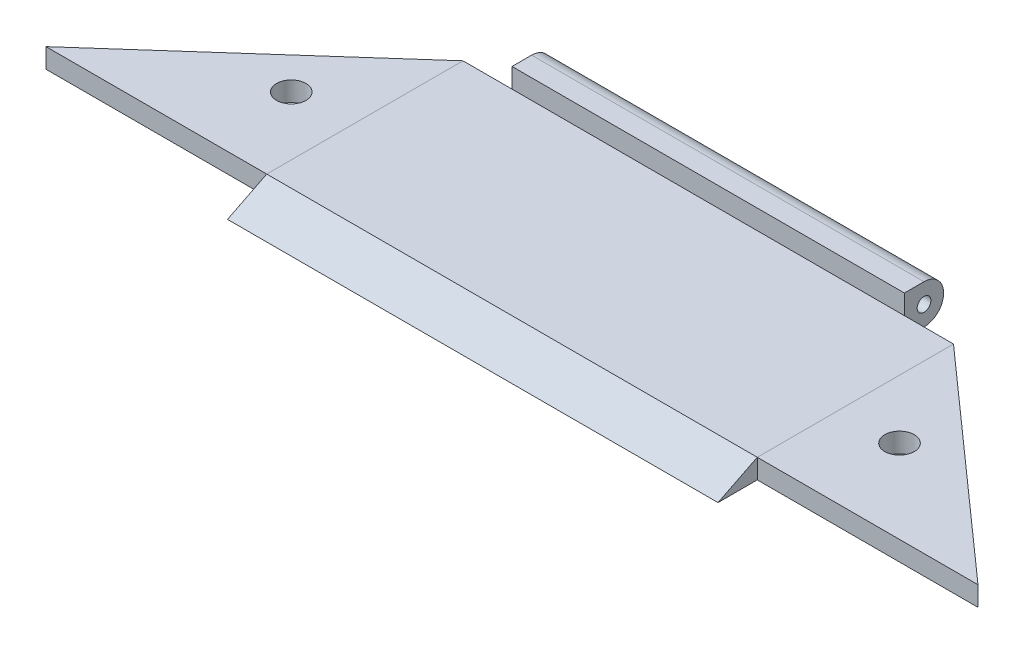
ISO-10303-21;
HEADER;
FILE_DESCRIPTION(('STEP AP214'),'2;1');
FILE_NAME('part.step','',(''),(''),'','','');
FILE_SCHEMA(('AUTOMOTIVE_DESIGN { 1 0 10303 214 1 1 1 1 }'));
ENDSEC;
DATA;
#1=APPLICATION_CONTEXT('core data for automotive mechanical design processes');
#2=APPLICATION_PROTOCOL_DEFINITION('international standard','automotive_design',2000,#1);
#3=PRODUCT_CONTEXT('',#1,'mechanical');
#4=PRODUCT('Part','Part','',(#3));
#5=PRODUCT_RELATED_PRODUCT_CATEGORY('part','',(#4));
#6=PRODUCT_DEFINITION_FORMATION('','',#4);
#7=PRODUCT_DEFINITION_CONTEXT('part definition',#1,'design');
#8=PRODUCT_DEFINITION('design','',#6,#7);
#9=PRODUCT_DEFINITION_SHAPE('','',#8);
#10=(LENGTH_UNIT() NAMED_UNIT(*) SI_UNIT(.MILLI.,.METRE.));
#11=(NAMED_UNIT(*) PLANE_ANGLE_UNIT() SI_UNIT($,.RADIAN.));
#12=(NAMED_UNIT(*) SI_UNIT($,.STERADIAN.) SOLID_ANGLE_UNIT());
#13=UNCERTAINTY_MEASURE_WITH_UNIT(LENGTH_MEASURE(1.E-05),#10,'distance_accuracy_value','');
#14=(GEOMETRIC_REPRESENTATION_CONTEXT(3) GLOBAL_UNCERTAINTY_ASSIGNED_CONTEXT((#13)) GLOBAL_UNIT_ASSIGNED_CONTEXT((#10,
#11,#12)) REPRESENTATION_CONTEXT('',''));
#15=CARTESIAN_POINT('',(0.,0.,0.));
#16=DIRECTION('',(0.,0.,1.));
#17=DIRECTION('',(1.,0.,0.));
#18=AXIS2_PLACEMENT_3D('',#15,#16,#17);
#19=CARTESIAN_POINT('',(-11.9069810338864,0.,-607.96292003175));
#20=DIRECTION('',(-0.66436383882992,0.,0.74740931868366));
#21=DIRECTION('',(0.74740931868366,0.,0.66436383882992));
#22=AXIS2_PLACEMENT_3D('',#19,#20,#21);
#23=PLANE('',#22);
#24=DIRECTION('',(0.74740931868366,0.,0.66436383882992));
#25=VECTOR('',#24,1.);
#26=CARTESIAN_POINT('',(-11.9069810338864,20.0000000000001,-607.96292003175));
#27=LINE('',#26,#25);
#28=CARTESIAN_POINT('',(500.,20.,-152.934492446074));
#29=VERTEX_POINT('',#28);
#30=CARTESIAN_POINT('',(725.,20.,47.0655075539265));
#31=VERTEX_POINT('',#30);
#32=EDGE_CURVE('E100',#29,#31,#27,.T.);
#33=ORIENTED_EDGE('',*,*,#32,.T.);
#34=DIRECTION('',(0.,1.,0.));
#35=VECTOR('',#34,1.);
#36=CARTESIAN_POINT('',(725.,0.,47.0655075539265));
#37=LINE('',#36,#35);
#38=CARTESIAN_POINT('',(725.,0.,47.0655075539265));
#39=VERTEX_POINT('',#38);
#40=EDGE_CURVE('E12',#39,#31,#37,.T.);
#41=ORIENTED_EDGE('',*,*,#40,.F.);
#42=DIRECTION('',(0.74740931868366,0.,0.66436383882992));
#43=VECTOR('',#42,1.);
#44=CARTESIAN_POINT('',(-11.9069810338864,0.,-607.96292003175));
#45=LINE('',#44,#43);
#46=CARTESIAN_POINT('',(500.,0.,-152.934492446074));
#47=VERTEX_POINT('',#46);
#48=EDGE_CURVE('E62',#47,#39,#45,.T.);
#49=ORIENTED_EDGE('',*,*,#48,.F.);
#50=DIRECTION('',(0.,1.,0.));
#51=VECTOR('',#50,1.);
#52=CARTESIAN_POINT('',(500.,0.,-152.934492446074));
#53=LINE('',#52,#51);
#54=EDGE_CURVE('E47',#47,#29,#53,.T.);
#55=ORIENTED_EDGE('',*,*,#54,.T.);
#56=EDGE_LOOP('',(#33,#41,#49,#55));
#57=FACE_BOUND('',#56,.T.);
#58=ADVANCED_FACE('F43',(#57),#23,.F.);
#59=CARTESIAN_POINT('',(-505.265583332266,0.,47.0655075539265));
#60=DIRECTION('',(0.,0.,1.));
#61=DIRECTION('',(0.,-1.,0.));
#62=AXIS2_PLACEMENT_3D('',#59,#60,#61);
#63=PLANE('',#62);
#64=DIRECTION('',(1.,0.,0.));
#65=VECTOR('',#64,1.);
#66=CARTESIAN_POINT('',(-505.265583332266,20.,47.0655075539265));
#67=LINE('',#66,#65);
#68=CARTESIAN_POINT('',(500.,20.,47.0655075539265));
#69=VERTEX_POINT('',#68);
#70=EDGE_CURVE('E93',#69,#31,#67,.T.);
#71=ORIENTED_EDGE('',*,*,#70,.F.);
#72=DIRECTION('',(0.,1.,0.));
#73=VECTOR('',#72,1.);
#74=CARTESIAN_POINT('',(500.,0.,47.0655075539265));
#75=LINE('',#74,#73);
#76=CARTESIAN_POINT('',(500.,0.,47.0655075539265));
#77=VERTEX_POINT('',#76);
#78=EDGE_CURVE('E53',#77,#69,#75,.T.);
#79=ORIENTED_EDGE('',*,*,#78,.F.);
#80=DIRECTION('',(1.,0.,0.));
#81=VECTOR('',#80,1.);
#82=CARTESIAN_POINT('',(-505.265583332266,0.,47.0655075539265));
#83=LINE('',#82,#81);
#84=EDGE_CURVE('E83',#77,#39,#83,.T.);
#85=ORIENTED_EDGE('',*,*,#84,.T.);
#86=ORIENTED_EDGE('',*,*,#40,.T.);
#87=EDGE_LOOP('',(#71,#79,#85,#86));
#88=FACE_BOUND('',#87,.T.);
#89=ADVANCED_FACE('F106',(#88),#63,.T.);
#90=CARTESIAN_POINT('',(560.,0.,-37.9344924460735));
#91=DIRECTION('',(0.,1.,0.));
#92=DIRECTION('',(0.,0.,1.));
#93=AXIS2_PLACEMENT_3D('',#90,#91,#92);
#94=CYLINDRICAL_SURFACE('',#93,15.);
#95=CARTESIAN_POINT('',(560.,0.,-37.9344924460735));
#96=DIRECTION('',(0.,1.,0.));
#97=DIRECTION('',(0.,0.,1.));
#98=AXIS2_PLACEMENT_3D('',#95,#96,#97);
#99=CIRCLE('',#98,15.);
#100=CARTESIAN_POINT('',(560.,0.,-22.9344924460735));
#101=VERTEX_POINT('',#100);
#102=EDGE_CURVE('E90',#101,#101,#99,.T.);
#103=ORIENTED_EDGE('',*,*,#102,.F.);
#104=EDGE_LOOP('',(#103));
#105=FACE_BOUND('',#104,.T.);
#106=CARTESIAN_POINT('',(560.,20.,-37.9344924460735));
#107=DIRECTION('',(0.,1.,0.));
#108=DIRECTION('',(0.,0.,1.));
#109=AXIS2_PLACEMENT_3D('',#106,#107,#108);
#110=CIRCLE('',#109,15.);
#111=CARTESIAN_POINT('',(560.,20.,-22.9344924460735));
#112=VERTEX_POINT('',#111);
#113=EDGE_CURVE('E97',#112,#112,#110,.T.);
#114=ORIENTED_EDGE('',*,*,#113,.T.);
#115=EDGE_LOOP('',(#114));
#116=FACE_BOUND('',#115,.T.);
#117=ADVANCED_FACE('F45',(#105,#116),#94,.F.);
#118=CARTESIAN_POINT('',(500.,0.,-52.9344924460734));
#119=DIRECTION('',(1.,0.,0.));
#120=DIRECTION('',(0.,0.,-1.));
#121=AXIS2_PLACEMENT_3D('',#118,#119,#120);
#122=PLANE('',#121);
#123=DIRECTION('',(0.,0.,-1.));
#124=VECTOR('',#123,1.);
#125=CARTESIAN_POINT('',(500.,20.,-52.9344924460734));
#126=LINE('',#125,#124);
#127=EDGE_CURVE('E87',#69,#29,#126,.T.);
#128=ORIENTED_EDGE('',*,*,#127,.T.);
#129=ORIENTED_EDGE('',*,*,#54,.F.);
#130=DIRECTION('',(0.,0.,-1.));
#131=VECTOR('',#130,1.);
#132=CARTESIAN_POINT('',(500.,0.,-52.9344924460734));
#133=LINE('',#132,#131);
#134=EDGE_CURVE('E80',#77,#47,#133,.T.);
#135=ORIENTED_EDGE('',*,*,#134,.F.);
#136=ORIENTED_EDGE('',*,*,#78,.T.);
#137=EDGE_LOOP('',(#128,#129,#135,#136));
#138=FACE_BOUND('',#137,.T.);
#139=ADVANCED_FACE('F86',(#138),#122,.F.);
#140=CARTESIAN_POINT('',(-505.265583332266,0.,-52.9344924460734));
#141=DIRECTION('',(0.,1.,0.));
#142=DIRECTION('',(0.,0.,1.));
#143=AXIS2_PLACEMENT_3D('',#140,#141,#142);
#144=PLANE('',#143);
#145=ORIENTED_EDGE('',*,*,#102,.T.);
#146=EDGE_LOOP('',(#145));
#147=FACE_BOUND('',#146,.T.);
#148=ORIENTED_EDGE('',*,*,#48,.T.);
#149=ORIENTED_EDGE('',*,*,#84,.F.);
#150=ORIENTED_EDGE('',*,*,#134,.T.);
#151=EDGE_LOOP('',(#148,#149,#150));
#152=FACE_BOUND('',#151,.T.);
#153=ADVANCED_FACE('F82',(#147,#152),#144,.F.);
#154=CARTESIAN_POINT('',(-505.265583332266,20.,-52.9344924460734));
#155=DIRECTION('',(0.,1.,0.));
#156=DIRECTION('',(0.,0.,1.));
#157=AXIS2_PLACEMENT_3D('',#154,#155,#156);
#158=PLANE('',#157);
#159=ORIENTED_EDGE('',*,*,#113,.F.);
#160=EDGE_LOOP('',(#159));
#161=FACE_BOUND('',#160,.T.);
#162=ORIENTED_EDGE('',*,*,#32,.F.);
#163=ORIENTED_EDGE('',*,*,#127,.F.);
#164=ORIENTED_EDGE('',*,*,#70,.T.);
#165=EDGE_LOOP('',(#162,#163,#164));
#166=FACE_BOUND('',#165,.T.);
#167=ADVANCED_FACE('F105',(#161,#166),#158,.T.);
#168=CLOSED_SHELL('',(#58,#89,#117,#139,#153,#167));
#169=MANIFOLD_SOLID_BREP('B2',#168);
#170=CARTESIAN_POINT('',(-505.265583332266,0.,47.0655075539265));
#171=DIRECTION('',(0.,0.,-1.));
#172=DIRECTION('',(0.,1.,0.));
#173=AXIS2_PLACEMENT_3D('',#170,#171,#172);
#174=PLANE('',#173);
#175=DIRECTION('',(-1.,0.,0.));
#176=VECTOR('',#175,1.);
#177=CARTESIAN_POINT('',(-505.265583332266,20.,47.0655075539265));
#178=LINE('',#177,#176);
#179=CARTESIAN_POINT('',(0.,20.,47.0655075539265));
#180=VERTEX_POINT('',#179);
#181=CARTESIAN_POINT('',(-225.,20.,47.0655075539265));
#182=VERTEX_POINT('',#181);
#183=EDGE_CURVE('E227',#180,#182,#178,.T.);
#184=ORIENTED_EDGE('',*,*,#183,.T.);
#185=DIRECTION('',(0.,1.,0.));
#186=VECTOR('',#185,1.);
#187=CARTESIAN_POINT('',(-225.,0.,47.0655075539265));
#188=LINE('',#187,#186);
#189=CARTESIAN_POINT('',(-225.,0.,47.0655075539265));
#190=VERTEX_POINT('',#189);
#191=EDGE_CURVE('E41',#190,#182,#188,.T.);
#192=ORIENTED_EDGE('',*,*,#191,.F.);
#193=DIRECTION('',(-1.,0.,0.));
#194=VECTOR('',#193,1.);
#195=CARTESIAN_POINT('',(-505.265583332266,0.,47.0655075539265));
#196=LINE('',#195,#194);
#197=CARTESIAN_POINT('',(0.,0.,47.0655075539265));
#198=VERTEX_POINT('',#197);
#199=EDGE_CURVE('E188',#198,#190,#196,.T.);
#200=ORIENTED_EDGE('',*,*,#199,.F.);
#201=DIRECTION('',(0.,1.,0.));
#202=VECTOR('',#201,1.);
#203=CARTESIAN_POINT('',(0.,0.,47.0655075539265));
#204=LINE('',#203,#202);
#205=EDGE_CURVE('E173',#198,#180,#204,.T.);
#206=ORIENTED_EDGE('',*,*,#205,.T.);
#207=EDGE_LOOP('',(#184,#192,#200,#206));
#208=FACE_BOUND('',#207,.T.);
#209=ADVANCED_FACE('F170',(#208),#174,.F.);
#210=CARTESIAN_POINT('',(-331.906981033887,0.,142.093935139604));
#211=DIRECTION('',(-0.66436383882992,0.,-0.74740931868366));
#212=DIRECTION('',(-0.74740931868366,0.,0.66436383882992));
#213=AXIS2_PLACEMENT_3D('',#210,#211,#212);
#214=PLANE('',#213);
#215=DIRECTION('',(-0.74740931868366,0.,0.66436383882992));
#216=VECTOR('',#215,1.);
#217=CARTESIAN_POINT('',(-331.906981033887,20.,142.093935139604));
#218=LINE('',#217,#216);
#219=CARTESIAN_POINT('',(0.,20.,-152.934492446074));
#220=VERTEX_POINT('',#219);
#221=EDGE_CURVE('E221',#220,#182,#218,.T.);
#222=ORIENTED_EDGE('',*,*,#221,.F.);
#223=DIRECTION('',(0.,1.,0.));
#224=VECTOR('',#223,1.);
#225=CARTESIAN_POINT('',(0.,0.,-152.934492446074));
#226=LINE('',#225,#224);
#227=CARTESIAN_POINT('',(0.,0.,-152.934492446074));
#228=VERTEX_POINT('',#227);
#229=EDGE_CURVE('E179',#228,#220,#226,.T.);
#230=ORIENTED_EDGE('',*,*,#229,.F.);
#231=DIRECTION('',(-0.74740931868366,0.,0.66436383882992));
#232=VECTOR('',#231,1.);
#233=CARTESIAN_POINT('',(-331.906981033887,0.,142.093935139604));
#234=LINE('',#233,#232);
#235=EDGE_CURVE('E210',#228,#190,#234,.T.);
#236=ORIENTED_EDGE('',*,*,#235,.T.);
#237=ORIENTED_EDGE('',*,*,#191,.T.);
#238=EDGE_LOOP('',(#222,#230,#236,#237));
#239=FACE_BOUND('',#238,.T.);
#240=ADVANCED_FACE('F234',(#239),#214,.T.);
#241=CARTESIAN_POINT('',(0.,0.,-52.9344924460734));
#242=DIRECTION('',(-1.,0.,0.));
#243=DIRECTION('',(0.,0.,1.));
#244=AXIS2_PLACEMENT_3D('',#241,#242,#243);
#245=PLANE('',#244);
#246=DIRECTION('',(0.,0.,1.));
#247=VECTOR('',#246,1.);
#248=CARTESIAN_POINT('',(0.,20.,-52.9344924460734));
#249=LINE('',#248,#247);
#250=EDGE_CURVE('E214',#220,#180,#249,.T.);
#251=ORIENTED_EDGE('',*,*,#250,.T.);
#252=ORIENTED_EDGE('',*,*,#205,.F.);
#253=DIRECTION('',(0.,0.,1.));
#254=VECTOR('',#253,1.);
#255=CARTESIAN_POINT('',(0.,0.,-52.9344924460734));
#256=LINE('',#255,#254);
#257=EDGE_CURVE('E206',#228,#198,#256,.T.);
#258=ORIENTED_EDGE('',*,*,#257,.F.);
#259=ORIENTED_EDGE('',*,*,#229,.T.);
#260=EDGE_LOOP('',(#251,#252,#258,#259));
#261=FACE_BOUND('',#260,.T.);
#262=ADVANCED_FACE('F213',(#261),#245,.F.);
#263=CARTESIAN_POINT('',(-60.0000000000001,0.,-37.9344924460735));
#264=DIRECTION('',(0.,1.,0.));
#265=DIRECTION('',(0.,0.,1.));
#266=AXIS2_PLACEMENT_3D('',#263,#264,#265);
#267=CYLINDRICAL_SURFACE('',#266,15.);
#268=CARTESIAN_POINT('',(-60.0000000000001,0.,-37.9344924460735));
#269=DIRECTION('',(0.,1.,0.));
#270=DIRECTION('',(0.,0.,1.));
#271=AXIS2_PLACEMENT_3D('',#268,#269,#270);
#272=CIRCLE('',#271,15.);
#273=CARTESIAN_POINT('',(-60.0000000000001,0.,-22.9344924460735));
#274=VERTEX_POINT('',#273);
#275=EDGE_CURVE('E217',#274,#274,#272,.F.);
#276=ORIENTED_EDGE('',*,*,#275,.T.);
#277=EDGE_LOOP('',(#276));
#278=FACE_BOUND('',#277,.T.);
#279=CARTESIAN_POINT('',(-60.0000000000001,20.,-37.9344924460735));
#280=DIRECTION('',(0.,1.,0.));
#281=DIRECTION('',(0.,0.,1.));
#282=AXIS2_PLACEMENT_3D('',#279,#280,#281);
#283=CIRCLE('',#282,15.);
#284=CARTESIAN_POINT('',(-60.0000000000001,20.,-22.9344924460735));
#285=VERTEX_POINT('',#284);
#286=EDGE_CURVE('E218',#285,#285,#283,.F.);
#287=ORIENTED_EDGE('',*,*,#286,.F.);
#288=EDGE_LOOP('',(#287));
#289=FACE_BOUND('',#288,.T.);
#290=ADVANCED_FACE('F241',(#278,#289),#267,.F.);
#291=CARTESIAN_POINT('',(-505.265583332266,0.,-52.9344924460734));
#292=DIRECTION('',(0.,1.,0.));
#293=DIRECTION('',(0.,0.,1.));
#294=AXIS2_PLACEMENT_3D('',#291,#292,#293);
#295=PLANE('',#294);
#296=ORIENTED_EDGE('',*,*,#199,.T.);
#297=ORIENTED_EDGE('',*,*,#235,.F.);
#298=ORIENTED_EDGE('',*,*,#257,.T.);
#299=EDGE_LOOP('',(#296,#297,#298));
#300=FACE_BOUND('',#299,.T.);
#301=ORIENTED_EDGE('',*,*,#275,.F.);
#302=EDGE_LOOP('',(#301));
#303=FACE_BOUND('',#302,.T.);
#304=ADVANCED_FACE('F208',(#300,#303),#295,.F.);
#305=CARTESIAN_POINT('',(-505.265583332266,20.,-52.9344924460734));
#306=DIRECTION('',(0.,1.,0.));
#307=DIRECTION('',(0.,0.,1.));
#308=AXIS2_PLACEMENT_3D('',#305,#306,#307);
#309=PLANE('',#308);
#310=ORIENTED_EDGE('',*,*,#183,.F.);
#311=ORIENTED_EDGE('',*,*,#250,.F.);
#312=ORIENTED_EDGE('',*,*,#221,.T.);
#313=EDGE_LOOP('',(#310,#311,#312));
#314=FACE_BOUND('',#313,.T.);
#315=ORIENTED_EDGE('',*,*,#286,.T.);
#316=EDGE_LOOP('',(#315));
#317=FACE_BOUND('',#316,.T.);
#318=ADVANCED_FACE('F232',(#314,#317),#309,.T.);
#319=CLOSED_SHELL('',(#209,#240,#262,#290,#304,#318));
#320=MANIFOLD_SOLID_BREP('B6',#319);
#321=CARTESIAN_POINT('',(500.,0.,-297.310962724989));
#322=DIRECTION('',(0.,1.,0.));
#323=DIRECTION('',(0.,0.,1.));
#324=AXIS2_PLACEMENT_3D('',#321,#322,#323);
#325=PLANE('',#324);
#326=DIRECTION('',(0.,0.,-1.));
#327=VECTOR('',#326,1.);
#328=CARTESIAN_POINT('',(50.,0.,-297.310962724989));
#329=LINE('',#328,#327);
#330=CARTESIAN_POINT('',(50.,0.,-152.934492446074));
#331=VERTEX_POINT('',#330);
#332=CARTESIAN_POINT('',(50.,0.,-172.934492446074));
#333=VERTEX_POINT('',#332);
#334=EDGE_CURVE('E396',#331,#333,#329,.T.);
#335=ORIENTED_EDGE('',*,*,#334,.T.);
#336=DIRECTION('',(-1.,0.,0.));
#337=VECTOR('',#336,1.);
#338=CARTESIAN_POINT('',(500.,0.,-172.934492446074));
#339=LINE('',#338,#337);
#340=CARTESIAN_POINT('',(450.,0.,-172.934492446074));
#341=VERTEX_POINT('',#340);
#342=EDGE_CURVE('E408',#333,#341,#339,.F.);
#343=ORIENTED_EDGE('',*,*,#342,.T.);
#344=DIRECTION('',(0.,0.,1.));
#345=VECTOR('',#344,1.);
#346=CARTESIAN_POINT('',(450.,0.,-297.310962724989));
#347=LINE('',#346,#345);
#348=CARTESIAN_POINT('',(450.,0.,-152.934492446074));
#349=VERTEX_POINT('',#348);
#350=EDGE_CURVE('E403',#341,#349,#347,.T.);
#351=ORIENTED_EDGE('',*,*,#350,.T.);
#352=DIRECTION('',(1.,0.,0.));
#353=VECTOR('',#352,1.);
#354=CARTESIAN_POINT('',(500.,0.,-152.934492446074));
#355=LINE('',#354,#353);
#356=CARTESIAN_POINT('',(500.,0.,-152.934492446074));
#357=VERTEX_POINT('',#356);
#358=EDGE_CURVE('E404',#349,#357,#355,.T.);
#359=ORIENTED_EDGE('',*,*,#358,.T.);
#360=DIRECTION('',(0.,0.,-1.));
#361=VECTOR('',#360,1.);
#362=CARTESIAN_POINT('',(500.,0.,-297.310962724989));
#363=LINE('',#362,#361);
#364=CARTESIAN_POINT('',(500.,0.,87.0655075539265));
#365=VERTEX_POINT('',#364);
#366=EDGE_CURVE('E433',#365,#357,#363,.T.);
#367=ORIENTED_EDGE('',*,*,#366,.F.);
#368=DIRECTION('',(-1.,0.,0.));
#369=VECTOR('',#368,1.);
#370=CARTESIAN_POINT('',(500.,0.,87.0655075539265));
#371=LINE('',#370,#369);
#372=CARTESIAN_POINT('',(0.,0.,87.0655075539265));
#373=VERTEX_POINT('',#372);
#374=EDGE_CURVE('E441',#365,#373,#371,.T.);
#375=ORIENTED_EDGE('',*,*,#374,.T.);
#376=DIRECTION('',(0.,0.,-1.));
#377=VECTOR('',#376,1.);
#378=CARTESIAN_POINT('',(0.,0.,-297.310962724989));
#379=LINE('',#378,#377);
#380=CARTESIAN_POINT('',(0.,0.,-152.934492446074));
#381=VERTEX_POINT('',#380);
#382=EDGE_CURVE('E432',#373,#381,#379,.T.);
#383=ORIENTED_EDGE('',*,*,#382,.T.);
#384=DIRECTION('',(1.,0.,0.));
#385=VECTOR('',#384,1.);
#386=CARTESIAN_POINT('',(500.,0.,-152.934492446074));
#387=LINE('',#386,#385);
#388=EDGE_CURVE('E397',#381,#331,#387,.T.);
#389=ORIENTED_EDGE('',*,*,#388,.T.);
#390=EDGE_LOOP('',(#335,#343,#351,#359,#367,#375,#383,#389));
#391=FACE_BOUND('',#390,.T.);
#392=ADVANCED_FACE('F289',(#391),#325,.F.);
#393=CARTESIAN_POINT('',(500.,40.,-297.310962724989));
#394=DIRECTION('',(0.,1.,0.));
#395=DIRECTION('',(0.,0.,1.));
#396=AXIS2_PLACEMENT_3D('',#393,#394,#395);
#397=PLANE('',#396);
#398=DIRECTION('',(0.,0.,1.));
#399=VECTOR('',#398,1.);
#400=CARTESIAN_POINT('',(450.,40.,-192.934492446074));
#401=LINE('',#400,#399);
#402=CARTESIAN_POINT('',(450.,40.,-172.934492446074));
#403=VERTEX_POINT('',#402);
#404=CARTESIAN_POINT('',(450.,40.,-152.934492446074));
#405=VERTEX_POINT('',#404);
#406=EDGE_CURVE('E360',#403,#405,#401,.T.);
#407=ORIENTED_EDGE('',*,*,#406,.F.);
#408=DIRECTION('',(-1.,0.,0.));
#409=VECTOR('',#408,1.);
#410=CARTESIAN_POINT('',(50.,40.,-172.934492446074));
#411=LINE('',#410,#409);
#412=CARTESIAN_POINT('',(50.,40.,-172.934492446074));
#413=VERTEX_POINT('',#412);
#414=EDGE_CURVE('E168',#403,#413,#411,.T.);
#415=ORIENTED_EDGE('',*,*,#414,.T.);
#416=DIRECTION('',(0.,0.,-1.));
#417=VECTOR('',#416,1.);
#418=CARTESIAN_POINT('',(50.,40.,-192.934492446074));
#419=LINE('',#418,#417);
#420=CARTESIAN_POINT('',(50.,40.,-152.934492446074));
#421=VERTEX_POINT('',#420);
#422=EDGE_CURVE('E383',#421,#413,#419,.T.);
#423=ORIENTED_EDGE('',*,*,#422,.F.);
#424=DIRECTION('',(-1.,0.,0.));
#425=VECTOR('',#424,1.);
#426=CARTESIAN_POINT('',(500.,40.,-152.934492446074));
#427=LINE('',#426,#425);
#428=EDGE_CURVE('E374',#405,#421,#427,.T.);
#429=ORIENTED_EDGE('',*,*,#428,.F.);
#430=EDGE_LOOP('',(#407,#415,#423,#429));
#431=FACE_BOUND('',#430,.T.);
#432=ADVANCED_FACE('F381',(#431),#397,.T.);
#433=CARTESIAN_POINT('',(500.,9.69893464448226,-152.934492446074));
#434=DIRECTION('',(0.,0.,1.));
#435=DIRECTION('',(1.,0.,0.));
#436=AXIS2_PLACEMENT_3D('',#433,#434,#435);
#437=PLANE('',#436);
#438=DIRECTION('',(0.,1.,0.));
#439=VECTOR('',#438,1.);
#440=CARTESIAN_POINT('',(450.,-460.,-152.934492446074));
#441=LINE('',#440,#439);
#442=CARTESIAN_POINT('',(450.,20.,-152.934492446074));
#443=VERTEX_POINT('',#442);
#444=EDGE_CURVE('E364',#443,#405,#441,.T.);
#445=ORIENTED_EDGE('',*,*,#444,.T.);
#446=ORIENTED_EDGE('',*,*,#428,.T.);
#447=DIRECTION('',(0.,1.,0.));
#448=VECTOR('',#447,1.);
#449=CARTESIAN_POINT('',(50.,-460.,-152.934492446074));
#450=LINE('',#449,#448);
#451=CARTESIAN_POINT('',(50.,20.,-152.934492446074));
#452=VERTEX_POINT('',#451);
#453=EDGE_CURVE('E421',#452,#421,#450,.T.);
#454=ORIENTED_EDGE('',*,*,#453,.F.);
#455=DIRECTION('',(-1.,0.,0.));
#456=VECTOR('',#455,1.);
#457=CARTESIAN_POINT('',(500.,20.,-152.934492446074));
#458=LINE('',#457,#456);
#459=EDGE_CURVE('E376',#443,#452,#458,.T.);
#460=ORIENTED_EDGE('',*,*,#459,.F.);
#461=EDGE_LOOP('',(#445,#446,#454,#460));
#462=FACE_BOUND('',#461,.T.);
#463=ADVANCED_FACE('F372',(#462),#437,.T.);
#464=CARTESIAN_POINT('',(500.,20.,-297.310962724989));
#465=DIRECTION('',(0.,-1.,0.));
#466=DIRECTION('',(0.,0.,-1.));
#467=AXIS2_PLACEMENT_3D('',#464,#465,#466);
#468=PLANE('',#467);
#469=DIRECTION('',(0.,0.,1.));
#470=VECTOR('',#469,1.);
#471=CARTESIAN_POINT('',(0.,20.,-297.310962724989));
#472=LINE('',#471,#470);
#473=CARTESIAN_POINT('',(0.,20.,-152.934492446074));
#474=VERTEX_POINT('',#473);
#475=CARTESIAN_POINT('',(0.,20.,47.0655075539265));
#476=VERTEX_POINT('',#475);
#477=EDGE_CURVE('E444',#474,#476,#472,.T.);
#478=ORIENTED_EDGE('',*,*,#477,.T.);
#479=DIRECTION('',(-1.,0.,0.));
#480=VECTOR('',#479,1.);
#481=CARTESIAN_POINT('',(500.,20.,47.0655075539265));
#482=LINE('',#481,#480);
#483=CARTESIAN_POINT('',(500.,20.,47.0655075539265));
#484=VERTEX_POINT('',#483);
#485=EDGE_CURVE('E448',#484,#476,#482,.T.);
#486=ORIENTED_EDGE('',*,*,#485,.F.);
#487=DIRECTION('',(0.,0.,1.));
#488=VECTOR('',#487,1.);
#489=CARTESIAN_POINT('',(500.,20.,-297.310962724989));
#490=LINE('',#489,#488);
#491=CARTESIAN_POINT('',(500.,20.,-152.934492446074));
#492=VERTEX_POINT('',#491);
#493=EDGE_CURVE('E436',#492,#484,#490,.T.);
#494=ORIENTED_EDGE('',*,*,#493,.F.);
#495=EDGE_CURVE('E385',#492,#443,#458,.T.);
#496=ORIENTED_EDGE('',*,*,#495,.T.);
#497=ORIENTED_EDGE('',*,*,#459,.T.);
#498=DIRECTION('',(-1.,0.,0.));
#499=VECTOR('',#498,1.);
#500=CARTESIAN_POINT('',(500.,20.,-152.934492446074));
#501=LINE('',#500,#499);
#502=EDGE_CURVE('E427',#452,#474,#501,.T.);
#503=ORIENTED_EDGE('',*,*,#502,.T.);
#504=EDGE_LOOP('',(#478,#486,#494,#496,#497,#503));
#505=FACE_BOUND('',#504,.T.);
#506=ADVANCED_FACE('F456',(#505),#468,.F.);
#507=CARTESIAN_POINT('',(500.,20.,-172.934492446074));
#508=DIRECTION('',(-1.,0.,0.));
#509=DIRECTION('',(0.,0.,1.));
#510=AXIS2_PLACEMENT_3D('',#507,#508,#509);
#511=CYLINDRICAL_SURFACE('',#510,7.00000000000001);
#512=CARTESIAN_POINT('',(450.,20.,-172.934492446074));
#513=DIRECTION('',(-1.,0.,0.));
#514=DIRECTION('',(0.,0.,1.));
#515=AXIS2_PLACEMENT_3D('',#512,#513,#514);
#516=CIRCLE('',#515,7.00000000000001);
#517=CARTESIAN_POINT('',(450.,20.,-165.934492446074));
#518=VERTEX_POINT('',#517);
#519=EDGE_CURVE('E400',#518,#518,#516,.T.);
#520=ORIENTED_EDGE('',*,*,#519,.F.);
#521=EDGE_LOOP('',(#520));
#522=FACE_BOUND('',#521,.T.);
#523=CARTESIAN_POINT('',(50.,20.,-172.934492446074));
#524=DIRECTION('',(1.,0.,0.));
#525=DIRECTION('',(0.,0.,-1.));
#526=AXIS2_PLACEMENT_3D('',#523,#524,#525);
#527=CIRCLE('',#526,7.00000000000001);
#528=CARTESIAN_POINT('',(50.,20.,-179.934492446074));
#529=VERTEX_POINT('',#528);
#530=EDGE_CURVE('E393',#529,#529,#527,.T.);
#531=ORIENTED_EDGE('',*,*,#530,.F.);
#532=EDGE_LOOP('',(#531));
#533=FACE_BOUND('',#532,.T.);
#534=ADVANCED_FACE('F487',(#522,#533),#511,.F.);
#535=CARTESIAN_POINT('',(500.,155.690375040462,-224.315242526999));
#536=DIRECTION('',(0.,-0.894427190999916,-0.447213595499958));
#537=DIRECTION('',(0.,0.447213595499958,-0.894427190999916));
#538=AXIS2_PLACEMENT_3D('',#535,#536,#537);
#539=PLANE('',#538);
#540=DIRECTION('',(0.,-0.447213595499958,0.894427190999916));
#541=VECTOR('',#540,1.);
#542=CARTESIAN_POINT('',(0.,155.690375040462,-224.315242526999));
#543=LINE('',#542,#541);
#544=EDGE_CURVE('E437',#476,#373,#543,.T.);
#545=ORIENTED_EDGE('',*,*,#544,.T.);
#546=ORIENTED_EDGE('',*,*,#374,.F.);
#547=DIRECTION('',(0.,-0.447213595499958,0.894427190999916));
#548=VECTOR('',#547,1.);
#549=CARTESIAN_POINT('',(500.,155.690375040462,-224.315242526999));
#550=LINE('',#549,#548);
#551=EDGE_CURVE('E439',#484,#365,#550,.T.);
#552=ORIENTED_EDGE('',*,*,#551,.F.);
#553=ORIENTED_EDGE('',*,*,#485,.T.);
#554=EDGE_LOOP('',(#545,#546,#552,#553));
#555=FACE_BOUND('',#554,.T.);
#556=ADVANCED_FACE('F489',(#555),#539,.F.);
#557=CARTESIAN_POINT('',(500.,9.69893464448226,-297.310962724989));
#558=DIRECTION('',(1.,0.,0.));
#559=DIRECTION('',(0.,0.,-1.));
#560=AXIS2_PLACEMENT_3D('',#557,#558,#559);
#561=PLANE('',#560);
#562=DIRECTION('',(0.,-1.,0.));
#563=VECTOR('',#562,1.);
#564=CARTESIAN_POINT('',(500.,9.69893464448226,-152.934492446074));
#565=LINE('',#564,#563);
#566=EDGE_CURVE('E388',#492,#357,#565,.T.);
#567=ORIENTED_EDGE('',*,*,#566,.F.);
#568=ORIENTED_EDGE('',*,*,#493,.T.);
#569=ORIENTED_EDGE('',*,*,#551,.T.);
#570=ORIENTED_EDGE('',*,*,#366,.T.);
#571=EDGE_LOOP('',(#567,#568,#569,#570));
#572=FACE_BOUND('',#571,.T.);
#573=ADVANCED_FACE('F495',(#572),#561,.T.);
#574=CARTESIAN_POINT('',(0.,9.69893464448226,-297.310962724989));
#575=DIRECTION('',(1.,0.,0.));
#576=DIRECTION('',(0.,0.,-1.));
#577=AXIS2_PLACEMENT_3D('',#574,#575,#576);
#578=PLANE('',#577);
#579=ORIENTED_EDGE('',*,*,#477,.F.);
#580=DIRECTION('',(0.,-1.,0.));
#581=VECTOR('',#580,1.);
#582=CARTESIAN_POINT('',(0.,9.69893464448226,-152.934492446074));
#583=LINE('',#582,#581);
#584=EDGE_CURVE('E384',#474,#381,#583,.T.);
#585=ORIENTED_EDGE('',*,*,#584,.T.);
#586=ORIENTED_EDGE('',*,*,#382,.F.);
#587=ORIENTED_EDGE('',*,*,#544,.F.);
#588=EDGE_LOOP('',(#579,#585,#586,#587));
#589=FACE_BOUND('',#588,.T.);
#590=ADVANCED_FACE('F503',(#589),#578,.F.);
#591=CARTESIAN_POINT('',(50.,-460.,-192.934492446074));
#592=DIRECTION('',(1.,0.,0.));
#593=DIRECTION('',(0.,0.,-1.));
#594=AXIS2_PLACEMENT_3D('',#591,#592,#593);
#595=PLANE('',#594);
#596=ORIENTED_EDGE('',*,*,#530,.T.);
#597=EDGE_LOOP('',(#596));
#598=FACE_BOUND('',#597,.T.);
#599=CARTESIAN_POINT('',(50.,20.,-172.934492446074));
#600=DIRECTION('',(1.,0.,0.));
#601=DIRECTION('',(0.,0.,-1.));
#602=AXIS2_PLACEMENT_3D('',#599,#600,#601);
#603=CIRCLE('',#602,20.);
#604=CARTESIAN_POINT('',(50.,20.,-192.934492446074));
#605=VERTEX_POINT('',#604);
#606=EDGE_CURVE('E399',#413,#605,#603,.F.);
#607=ORIENTED_EDGE('',*,*,#606,.T.);
#608=CARTESIAN_POINT('',(50.,20.,-172.934492446074));
#609=DIRECTION('',(1.,0.,0.));
#610=DIRECTION('',(0.,0.,-1.));
#611=AXIS2_PLACEMENT_3D('',#608,#609,#610);
#612=CIRCLE('',#611,20.);
#613=EDGE_CURVE('E406',#605,#333,#612,.F.);
#614=ORIENTED_EDGE('',*,*,#613,.T.);
#615=ORIENTED_EDGE('',*,*,#334,.F.);
#616=EDGE_CURVE('E426',#331,#452,#450,.T.);
#617=ORIENTED_EDGE('',*,*,#616,.T.);
#618=ORIENTED_EDGE('',*,*,#453,.T.);
#619=ORIENTED_EDGE('',*,*,#422,.T.);
#620=EDGE_LOOP('',(#607,#614,#615,#617,#618,#619));
#621=FACE_BOUND('',#620,.T.);
#622=ADVANCED_FACE('F464',(#598,#621),#595,.F.);
#623=CARTESIAN_POINT('',(0.,-460.,-152.934492446074));
#624=DIRECTION('',(0.,0.,1.));
#625=DIRECTION('',(1.,0.,0.));
#626=AXIS2_PLACEMENT_3D('',#623,#624,#625);
#627=PLANE('',#626);
#628=ORIENTED_EDGE('',*,*,#584,.F.);
#629=ORIENTED_EDGE('',*,*,#502,.F.);
#630=ORIENTED_EDGE('',*,*,#616,.F.);
#631=ORIENTED_EDGE('',*,*,#388,.F.);
#632=EDGE_LOOP('',(#628,#629,#630,#631));
#633=FACE_BOUND('',#632,.T.);
#634=ADVANCED_FACE('F462',(#633),#627,.F.);
#635=CARTESIAN_POINT('',(450.,-460.,-192.934492446074));
#636=DIRECTION('',(-1.,0.,0.));
#637=DIRECTION('',(0.,0.,1.));
#638=AXIS2_PLACEMENT_3D('',#635,#636,#637);
#639=PLANE('',#638);
#640=ORIENTED_EDGE('',*,*,#519,.T.);
#641=EDGE_LOOP('',(#640));
#642=FACE_BOUND('',#641,.T.);
#643=ORIENTED_EDGE('',*,*,#350,.F.);
#644=CARTESIAN_POINT('',(450.,20.,-172.934492446074));
#645=DIRECTION('',(-1.,0.,0.));
#646=DIRECTION('',(0.,0.,1.));
#647=AXIS2_PLACEMENT_3D('',#644,#645,#646);
#648=CIRCLE('',#647,20.);
#649=CARTESIAN_POINT('',(450.,20.,-192.934492446074));
#650=VERTEX_POINT('',#649);
#651=EDGE_CURVE('E298',#341,#650,#648,.F.);
#652=ORIENTED_EDGE('',*,*,#651,.T.);
#653=CARTESIAN_POINT('',(450.,20.,-172.934492446074));
#654=DIRECTION('',(-1.,0.,0.));
#655=DIRECTION('',(0.,0.,1.));
#656=AXIS2_PLACEMENT_3D('',#653,#654,#655);
#657=CIRCLE('',#656,20.);
#658=EDGE_CURVE('E305',#650,#403,#657,.F.);
#659=ORIENTED_EDGE('',*,*,#658,.T.);
#660=ORIENTED_EDGE('',*,*,#406,.T.);
#661=ORIENTED_EDGE('',*,*,#444,.F.);
#662=EDGE_CURVE('E378',#349,#443,#441,.T.);
#663=ORIENTED_EDGE('',*,*,#662,.F.);
#664=EDGE_LOOP('',(#643,#652,#659,#660,#661,#663));
#665=FACE_BOUND('',#664,.T.);
#666=ADVANCED_FACE('F362',(#642,#665),#639,.F.);
#667=CARTESIAN_POINT('',(450.,-460.,-152.934492446074));
#668=DIRECTION('',(0.,0.,1.));
#669=DIRECTION('',(1.,0.,0.));
#670=AXIS2_PLACEMENT_3D('',#667,#668,#669);
#671=PLANE('',#670);
#672=ORIENTED_EDGE('',*,*,#662,.T.);
#673=ORIENTED_EDGE('',*,*,#495,.F.);
#674=ORIENTED_EDGE('',*,*,#566,.T.);
#675=ORIENTED_EDGE('',*,*,#358,.F.);
#676=EDGE_LOOP('',(#672,#673,#674,#675));
#677=FACE_BOUND('',#676,.T.);
#678=ADVANCED_FACE('F471',(#677),#671,.F.);
#679=CARTESIAN_POINT('',(500.,20.,-172.934492446074));
#680=DIRECTION('',(1.,0.,0.));
#681=DIRECTION('',(0.,0.,-1.));
#682=AXIS2_PLACEMENT_3D('',#679,#680,#681);
#683=CYLINDRICAL_SURFACE('',#682,20.);
#684=ORIENTED_EDGE('',*,*,#414,.F.);
#685=ORIENTED_EDGE('',*,*,#658,.F.);
#686=DIRECTION('',(-1.,0.,0.));
#687=VECTOR('',#686,1.);
#688=CARTESIAN_POINT('',(450.,20.,-192.934492446074));
#689=LINE('',#688,#687);
#690=EDGE_CURVE('E293',#605,#650,#689,.F.);
#691=ORIENTED_EDGE('',*,*,#690,.F.);
#692=ORIENTED_EDGE('',*,*,#606,.F.);
#693=EDGE_LOOP('',(#684,#685,#691,#692));
#694=FACE_BOUND('',#693,.T.);
#695=ADVANCED_FACE('F291',(#694),#683,.T.);
#696=CARTESIAN_POINT('',(500.,20.,-172.934492446074));
#697=DIRECTION('',(-1.,0.,0.));
#698=DIRECTION('',(0.,0.,1.));
#699=AXIS2_PLACEMENT_3D('',#696,#697,#698);
#700=CYLINDRICAL_SURFACE('',#699,20.);
#701=ORIENTED_EDGE('',*,*,#651,.F.);
#702=ORIENTED_EDGE('',*,*,#342,.F.);
#703=ORIENTED_EDGE('',*,*,#613,.F.);
#704=ORIENTED_EDGE('',*,*,#690,.T.);
#705=EDGE_LOOP('',(#701,#702,#703,#704));
#706=FACE_BOUND('',#705,.T.);
#707=ADVANCED_FACE('F468',(#706),#700,.T.);
#708=CLOSED_SHELL('',(#392,#432,#463,#506,#534,#556,#573,#590,#622,#634,#666,#678,#695,#707));
#709=MANIFOLD_SOLID_BREP('B35',#708);
#710=ADVANCED_BREP_SHAPE_REPRESENTATION('',(#18,#169,#320,#709),#14);
#711=SHAPE_DEFINITION_REPRESENTATION(#9,#710);
ENDSEC;
END-ISO-10303-21;
